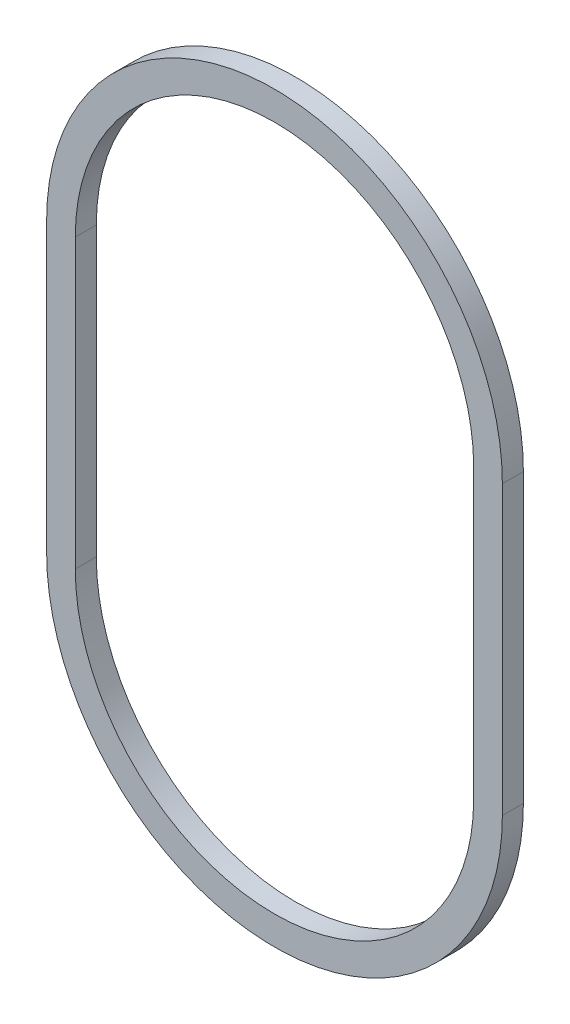
ISO-10303-21;
HEADER;
FILE_DESCRIPTION(('STEP AP214'),'2;1');
FILE_NAME('part.step','',(''),(''),'','','');
FILE_SCHEMA(('AUTOMOTIVE_DESIGN { 1 0 10303 214 1 1 1 1 }'));
ENDSEC;
DATA;
#1=APPLICATION_CONTEXT('core data for automotive mechanical design processes');
#2=APPLICATION_PROTOCOL_DEFINITION('international standard','automotive_design',2000,#1);
#3=PRODUCT_CONTEXT('',#1,'mechanical');
#4=PRODUCT('Part','Part','',(#3));
#5=PRODUCT_RELATED_PRODUCT_CATEGORY('part','',(#4));
#6=PRODUCT_DEFINITION_FORMATION('','',#4);
#7=PRODUCT_DEFINITION_CONTEXT('part definition',#1,'design');
#8=PRODUCT_DEFINITION('design','',#6,#7);
#9=PRODUCT_DEFINITION_SHAPE('','',#8);
#10=(LENGTH_UNIT() NAMED_UNIT(*) SI_UNIT(.MILLI.,.METRE.));
#11=(NAMED_UNIT(*) PLANE_ANGLE_UNIT() SI_UNIT($,.RADIAN.));
#12=(NAMED_UNIT(*) SI_UNIT($,.STERADIAN.) SOLID_ANGLE_UNIT());
#13=UNCERTAINTY_MEASURE_WITH_UNIT(LENGTH_MEASURE(1.E-05),#10,'distance_accuracy_value','');
#14=(GEOMETRIC_REPRESENTATION_CONTEXT(3) GLOBAL_UNCERTAINTY_ASSIGNED_CONTEXT((#13)) GLOBAL_UNIT_ASSIGNED_CONTEXT((#10,
#11,#12)) REPRESENTATION_CONTEXT('',''));
#15=CARTESIAN_POINT('',(0.,0.,0.));
#16=DIRECTION('',(0.,0.,1.));
#17=DIRECTION('',(1.,0.,0.));
#18=AXIS2_PLACEMENT_3D('',#15,#16,#17);
#19=CARTESIAN_POINT('',(0.,-15.04,1.1));
#20=DIRECTION('',(0.,0.,-1.));
#21=DIRECTION('',(-1.,0.,0.));
#22=AXIS2_PLACEMENT_3D('',#19,#20,#21);
#23=PLANE('',#22);
#24=CARTESIAN_POINT('',(0.,-15.04,1.1));
#25=DIRECTION('',(0.,0.,1.));
#26=DIRECTION('',(-1.,0.,0.));
#27=AXIS2_PLACEMENT_3D('',#24,#25,#26);
#28=CIRCLE('',#27,23.85);
#29=CARTESIAN_POINT('',(-23.85,-15.04,1.1));
#30=VERTEX_POINT('',#29);
#31=CARTESIAN_POINT('',(23.85,-15.04,1.1));
#32=VERTEX_POINT('',#31);
#33=EDGE_CURVE('E142',#30,#32,#28,.T.);
#34=ORIENTED_EDGE('',*,*,#33,.T.);
#35=DIRECTION('',(0.,1.,0.));
#36=VECTOR('',#35,1.);
#37=CARTESIAN_POINT('',(23.85,-15.04,1.1));
#38=LINE('',#37,#36);
#39=CARTESIAN_POINT('',(23.85,15.04,1.1));
#40=VERTEX_POINT('',#39);
#41=EDGE_CURVE('E145',#32,#40,#38,.T.);
#42=ORIENTED_EDGE('',*,*,#41,.T.);
#43=CARTESIAN_POINT('',(0.,15.04,1.1));
#44=DIRECTION('',(0.,0.,1.));
#45=DIRECTION('',(1.,0.,0.));
#46=AXIS2_PLACEMENT_3D('',#43,#44,#45);
#47=CIRCLE('',#46,23.85);
#48=CARTESIAN_POINT('',(-23.85,15.04,1.1));
#49=VERTEX_POINT('',#48);
#50=EDGE_CURVE('E148',#40,#49,#47,.T.);
#51=ORIENTED_EDGE('',*,*,#50,.T.);
#52=DIRECTION('',(0.,-1.,0.));
#53=VECTOR('',#52,1.);
#54=CARTESIAN_POINT('',(-23.85,15.04,1.1));
#55=LINE('',#54,#53);
#56=EDGE_CURVE('E150',#49,#30,#55,.T.);
#57=ORIENTED_EDGE('',*,*,#56,.T.);
#58=EDGE_LOOP('',(#34,#42,#51,#57));
#59=FACE_BOUND('',#58,.T.);
#60=CARTESIAN_POINT('',(0.,15.04,1.1));
#61=DIRECTION('',(0.,0.,1.));
#62=DIRECTION('',(1.,0.,0.));
#63=AXIS2_PLACEMENT_3D('',#60,#61,#62);
#64=CIRCLE('',#63,20.85);
#65=CARTESIAN_POINT('',(20.85,15.04,1.1));
#66=VERTEX_POINT('',#65);
#67=CARTESIAN_POINT('',(-20.85,15.04,1.1));
#68=VERTEX_POINT('',#67);
#69=EDGE_CURVE('E106',#66,#68,#64,.T.);
#70=ORIENTED_EDGE('',*,*,#69,.F.);
#71=DIRECTION('',(0.,1.,0.));
#72=VECTOR('',#71,1.);
#73=CARTESIAN_POINT('',(20.85,-15.04,1.1));
#74=LINE('',#73,#72);
#75=CARTESIAN_POINT('',(20.85,-15.04,1.1));
#76=VERTEX_POINT('',#75);
#77=EDGE_CURVE('E128',#76,#66,#74,.T.);
#78=ORIENTED_EDGE('',*,*,#77,.F.);
#79=CARTESIAN_POINT('',(0.,-15.04,1.1));
#80=DIRECTION('',(0.,0.,1.));
#81=DIRECTION('',(-1.,0.,0.));
#82=AXIS2_PLACEMENT_3D('',#79,#80,#81);
#83=CIRCLE('',#82,20.85);
#84=CARTESIAN_POINT('',(-20.85,-15.04,1.1));
#85=VERTEX_POINT('',#84);
#86=EDGE_CURVE('E126',#85,#76,#83,.T.);
#87=ORIENTED_EDGE('',*,*,#86,.F.);
#88=DIRECTION('',(0.,-1.,0.));
#89=VECTOR('',#88,1.);
#90=CARTESIAN_POINT('',(-20.85,15.04,1.1));
#91=LINE('',#90,#89);
#92=EDGE_CURVE('E114',#68,#85,#91,.T.);
#93=ORIENTED_EDGE('',*,*,#92,.F.);
#94=EDGE_LOOP('',(#70,#78,#87,#93));
#95=FACE_BOUND('',#94,.T.);
#96=ADVANCED_FACE('F41',(#59,#95),#23,.F.);
#97=CARTESIAN_POINT('',(0.,-15.04,-1.1));
#98=DIRECTION('',(0.,0.,-1.));
#99=DIRECTION('',(-1.,0.,0.));
#100=AXIS2_PLACEMENT_3D('',#97,#98,#99);
#101=PLANE('',#100);
#102=CARTESIAN_POINT('',(0.,-15.04,-1.1));
#103=DIRECTION('',(0.,0.,1.));
#104=DIRECTION('',(-1.,0.,0.));
#105=AXIS2_PLACEMENT_3D('',#102,#103,#104);
#106=CIRCLE('',#105,23.85);
#107=CARTESIAN_POINT('',(-23.85,-15.04,-1.1));
#108=VERTEX_POINT('',#107);
#109=CARTESIAN_POINT('',(23.85,-15.04,-1.1));
#110=VERTEX_POINT('',#109);
#111=EDGE_CURVE('E122',#108,#110,#106,.T.);
#112=ORIENTED_EDGE('',*,*,#111,.F.);
#113=DIRECTION('',(0.,-1.,0.));
#114=VECTOR('',#113,1.);
#115=CARTESIAN_POINT('',(-23.85,15.04,-1.1));
#116=LINE('',#115,#114);
#117=CARTESIAN_POINT('',(-23.85,15.04,-1.1));
#118=VERTEX_POINT('',#117);
#119=EDGE_CURVE('E146',#118,#108,#116,.T.);
#120=ORIENTED_EDGE('',*,*,#119,.F.);
#121=CARTESIAN_POINT('',(0.,15.04,-1.1));
#122=DIRECTION('',(0.,0.,1.));
#123=DIRECTION('',(1.,0.,0.));
#124=AXIS2_PLACEMENT_3D('',#121,#122,#123);
#125=CIRCLE('',#124,23.85);
#126=CARTESIAN_POINT('',(23.85,15.04,-1.1));
#127=VERTEX_POINT('',#126);
#128=EDGE_CURVE('E157',#127,#118,#125,.T.);
#129=ORIENTED_EDGE('',*,*,#128,.F.);
#130=DIRECTION('',(0.,1.,0.));
#131=VECTOR('',#130,1.);
#132=CARTESIAN_POINT('',(23.85,-15.04,-1.1));
#133=LINE('',#132,#131);
#134=EDGE_CURVE('E155',#110,#127,#133,.T.);
#135=ORIENTED_EDGE('',*,*,#134,.F.);
#136=EDGE_LOOP('',(#112,#120,#129,#135));
#137=FACE_BOUND('',#136,.T.);
#138=DIRECTION('',(0.,1.,0.));
#139=VECTOR('',#138,1.);
#140=CARTESIAN_POINT('',(20.85,-15.04,-1.1));
#141=LINE('',#140,#139);
#142=CARTESIAN_POINT('',(20.85,-15.04,-1.1));
#143=VERTEX_POINT('',#142);
#144=CARTESIAN_POINT('',(20.85,15.04,-1.1));
#145=VERTEX_POINT('',#144);
#146=EDGE_CURVE('E115',#143,#145,#141,.T.);
#147=ORIENTED_EDGE('',*,*,#146,.T.);
#148=CARTESIAN_POINT('',(0.,15.04,-1.1));
#149=DIRECTION('',(0.,0.,1.));
#150=DIRECTION('',(1.,0.,0.));
#151=AXIS2_PLACEMENT_3D('',#148,#149,#150);
#152=CIRCLE('',#151,20.85);
#153=CARTESIAN_POINT('',(-20.85,15.04,-1.1));
#154=VERTEX_POINT('',#153);
#155=EDGE_CURVE('E64',#145,#154,#152,.T.);
#156=ORIENTED_EDGE('',*,*,#155,.T.);
#157=DIRECTION('',(0.,-1.,0.));
#158=VECTOR('',#157,1.);
#159=CARTESIAN_POINT('',(-20.85,15.04,-1.1));
#160=LINE('',#159,#158);
#161=CARTESIAN_POINT('',(-20.85,-15.04,-1.1));
#162=VERTEX_POINT('',#161);
#163=EDGE_CURVE('E121',#154,#162,#160,.T.);
#164=ORIENTED_EDGE('',*,*,#163,.T.);
#165=CARTESIAN_POINT('',(0.,-15.04,-1.1));
#166=DIRECTION('',(0.,0.,1.));
#167=DIRECTION('',(-1.,0.,0.));
#168=AXIS2_PLACEMENT_3D('',#165,#166,#167);
#169=CIRCLE('',#168,20.85);
#170=EDGE_CURVE('E134',#162,#143,#169,.T.);
#171=ORIENTED_EDGE('',*,*,#170,.T.);
#172=EDGE_LOOP('',(#147,#156,#164,#171));
#173=FACE_BOUND('',#172,.T.);
#174=ADVANCED_FACE('F175',(#137,#173),#101,.T.);
#175=CARTESIAN_POINT('',(0.,-15.04,1.1));
#176=DIRECTION('',(0.,0.,-1.));
#177=DIRECTION('',(-1.,0.,0.));
#178=AXIS2_PLACEMENT_3D('',#175,#176,#177);
#179=CYLINDRICAL_SURFACE('',#178,23.85);
#180=ORIENTED_EDGE('',*,*,#111,.T.);
#181=DIRECTION('',(0.,0.,-1.));
#182=VECTOR('',#181,1.);
#183=CARTESIAN_POINT('',(23.85,-15.04,1.1));
#184=LINE('',#183,#182);
#185=EDGE_CURVE('E11',#32,#110,#184,.T.);
#186=ORIENTED_EDGE('',*,*,#185,.F.);
#187=ORIENTED_EDGE('',*,*,#33,.F.);
#188=DIRECTION('',(0.,0.,-1.));
#189=VECTOR('',#188,1.);
#190=CARTESIAN_POINT('',(-23.85,-15.04,1.1));
#191=LINE('',#190,#189);
#192=EDGE_CURVE('E152',#30,#108,#191,.T.);
#193=ORIENTED_EDGE('',*,*,#192,.T.);
#194=EDGE_LOOP('',(#180,#186,#187,#193));
#195=FACE_BOUND('',#194,.T.);
#196=ADVANCED_FACE('F43',(#195),#179,.T.);
#197=CARTESIAN_POINT('',(23.85,-15.04,1.1));
#198=DIRECTION('',(-1.,0.,0.));
#199=DIRECTION('',(0.,0.,1.));
#200=AXIS2_PLACEMENT_3D('',#197,#198,#199);
#201=PLANE('',#200);
#202=ORIENTED_EDGE('',*,*,#134,.T.);
#203=DIRECTION('',(0.,0.,-1.));
#204=VECTOR('',#203,1.);
#205=CARTESIAN_POINT('',(23.85,15.04,1.1));
#206=LINE('',#205,#204);
#207=EDGE_CURVE('E49',#40,#127,#206,.T.);
#208=ORIENTED_EDGE('',*,*,#207,.F.);
#209=ORIENTED_EDGE('',*,*,#41,.F.);
#210=ORIENTED_EDGE('',*,*,#185,.T.);
#211=EDGE_LOOP('',(#202,#208,#209,#210));
#212=FACE_BOUND('',#211,.T.);
#213=ADVANCED_FACE('F185',(#212),#201,.F.);
#214=CARTESIAN_POINT('',(0.,15.04,1.1));
#215=DIRECTION('',(0.,0.,-1.));
#216=DIRECTION('',(-1.,0.,0.));
#217=AXIS2_PLACEMENT_3D('',#214,#215,#216);
#218=CYLINDRICAL_SURFACE('',#217,23.85);
#219=ORIENTED_EDGE('',*,*,#128,.T.);
#220=DIRECTION('',(0.,0.,-1.));
#221=VECTOR('',#220,1.);
#222=CARTESIAN_POINT('',(-23.85,15.04,1.1));
#223=LINE('',#222,#221);
#224=EDGE_CURVE('E162',#49,#118,#223,.T.);
#225=ORIENTED_EDGE('',*,*,#224,.F.);
#226=ORIENTED_EDGE('',*,*,#50,.F.);
#227=ORIENTED_EDGE('',*,*,#207,.T.);
#228=EDGE_LOOP('',(#219,#225,#226,#227));
#229=FACE_BOUND('',#228,.T.);
#230=ADVANCED_FACE('F169',(#229),#218,.T.);
#231=CARTESIAN_POINT('',(-23.85,15.04,1.1));
#232=DIRECTION('',(1.,0.,0.));
#233=DIRECTION('',(0.,0.,-1.));
#234=AXIS2_PLACEMENT_3D('',#231,#232,#233);
#235=PLANE('',#234);
#236=ORIENTED_EDGE('',*,*,#119,.T.);
#237=ORIENTED_EDGE('',*,*,#192,.F.);
#238=ORIENTED_EDGE('',*,*,#56,.F.);
#239=ORIENTED_EDGE('',*,*,#224,.T.);
#240=EDGE_LOOP('',(#236,#237,#238,#239));
#241=FACE_BOUND('',#240,.T.);
#242=ADVANCED_FACE('F179',(#241),#235,.F.);
#243=CARTESIAN_POINT('',(0.,15.04,1.1));
#244=DIRECTION('',(0.,0.,-1.));
#245=DIRECTION('',(-1.,0.,0.));
#246=AXIS2_PLACEMENT_3D('',#243,#244,#245);
#247=CYLINDRICAL_SURFACE('',#246,20.85);
#248=ORIENTED_EDGE('',*,*,#155,.F.);
#249=DIRECTION('',(0.,0.,-1.));
#250=VECTOR('',#249,1.);
#251=CARTESIAN_POINT('',(20.85,15.04,1.1));
#252=LINE('',#251,#250);
#253=EDGE_CURVE('E110',#66,#145,#252,.T.);
#254=ORIENTED_EDGE('',*,*,#253,.F.);
#255=ORIENTED_EDGE('',*,*,#69,.T.);
#256=DIRECTION('',(0.,0.,-1.));
#257=VECTOR('',#256,1.);
#258=CARTESIAN_POINT('',(-20.85,15.04,1.1));
#259=LINE('',#258,#257);
#260=EDGE_CURVE('E109',#68,#154,#259,.T.);
#261=ORIENTED_EDGE('',*,*,#260,.T.);
#262=EDGE_LOOP('',(#248,#254,#255,#261));
#263=FACE_BOUND('',#262,.T.);
#264=ADVANCED_FACE('F108',(#263),#247,.F.);
#265=CARTESIAN_POINT('',(-20.85,15.04,1.1));
#266=DIRECTION('',(1.,0.,0.));
#267=DIRECTION('',(0.,0.,-1.));
#268=AXIS2_PLACEMENT_3D('',#265,#266,#267);
#269=PLANE('',#268);
#270=ORIENTED_EDGE('',*,*,#163,.F.);
#271=ORIENTED_EDGE('',*,*,#260,.F.);
#272=ORIENTED_EDGE('',*,*,#92,.T.);
#273=DIRECTION('',(0.,0.,-1.));
#274=VECTOR('',#273,1.);
#275=CARTESIAN_POINT('',(-20.85,-15.04,1.1));
#276=LINE('',#275,#274);
#277=EDGE_CURVE('E123',#85,#162,#276,.T.);
#278=ORIENTED_EDGE('',*,*,#277,.T.);
#279=EDGE_LOOP('',(#270,#271,#272,#278));
#280=FACE_BOUND('',#279,.T.);
#281=ADVANCED_FACE('F118',(#280),#269,.T.);
#282=CARTESIAN_POINT('',(0.,-15.04,1.1));
#283=DIRECTION('',(0.,0.,-1.));
#284=DIRECTION('',(-1.,0.,0.));
#285=AXIS2_PLACEMENT_3D('',#282,#283,#284);
#286=CYLINDRICAL_SURFACE('',#285,20.85);
#287=ORIENTED_EDGE('',*,*,#170,.F.);
#288=ORIENTED_EDGE('',*,*,#277,.F.);
#289=ORIENTED_EDGE('',*,*,#86,.T.);
#290=DIRECTION('',(0.,0.,-1.));
#291=VECTOR('',#290,1.);
#292=CARTESIAN_POINT('',(20.85,-15.04,1.1));
#293=LINE('',#292,#291);
#294=EDGE_CURVE('E56',#76,#143,#293,.T.);
#295=ORIENTED_EDGE('',*,*,#294,.T.);
#296=EDGE_LOOP('',(#287,#288,#289,#295));
#297=FACE_BOUND('',#296,.T.);
#298=ADVANCED_FACE('F208',(#297),#286,.F.);
#299=CARTESIAN_POINT('',(20.85,-15.04,1.1));
#300=DIRECTION('',(-1.,0.,0.));
#301=DIRECTION('',(0.,0.,1.));
#302=AXIS2_PLACEMENT_3D('',#299,#300,#301);
#303=PLANE('',#302);
#304=ORIENTED_EDGE('',*,*,#146,.F.);
#305=ORIENTED_EDGE('',*,*,#294,.F.);
#306=ORIENTED_EDGE('',*,*,#77,.T.);
#307=ORIENTED_EDGE('',*,*,#253,.T.);
#308=EDGE_LOOP('',(#304,#305,#306,#307));
#309=FACE_BOUND('',#308,.T.);
#310=ADVANCED_FACE('F212',(#309),#303,.T.);
#311=CLOSED_SHELL('',(#96,#174,#196,#213,#230,#242,#264,#281,#298,#310));
#312=MANIFOLD_SOLID_BREP('B2',#311);
#313=ADVANCED_BREP_SHAPE_REPRESENTATION('',(#18,#312),#14);
#314=SHAPE_DEFINITION_REPRESENTATION(#9,#313);
ENDSEC;
END-ISO-10303-21;
